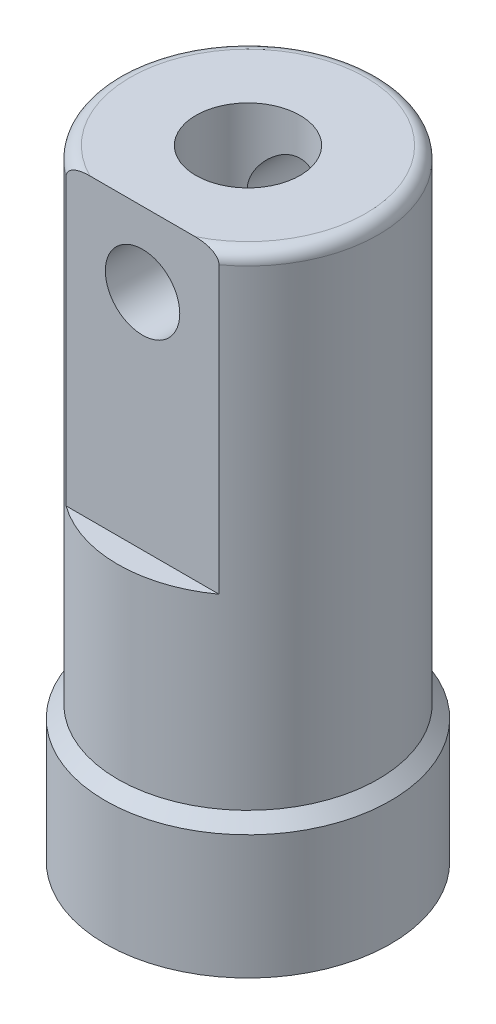
ISO-10303-21;
HEADER;
FILE_DESCRIPTION(('STEP AP214'),'2;1');
FILE_NAME('part.step','',(''),(''),'','','');
FILE_SCHEMA(('AUTOMOTIVE_DESIGN { 1 0 10303 214 1 1 1 1 }'));
ENDSEC;
DATA;
#1=APPLICATION_CONTEXT('core data for automotive mechanical design processes');
#2=APPLICATION_PROTOCOL_DEFINITION('international standard','automotive_design',2000,#1);
#3=PRODUCT_CONTEXT('',#1,'mechanical');
#4=PRODUCT('Part','Part','',(#3));
#5=PRODUCT_RELATED_PRODUCT_CATEGORY('part','',(#4));
#6=PRODUCT_DEFINITION_FORMATION('','',#4);
#7=PRODUCT_DEFINITION_CONTEXT('part definition',#1,'design');
#8=PRODUCT_DEFINITION('design','',#6,#7);
#9=PRODUCT_DEFINITION_SHAPE('','',#8);
#10=(LENGTH_UNIT() NAMED_UNIT(*) SI_UNIT(.MILLI.,.METRE.));
#11=(NAMED_UNIT(*) PLANE_ANGLE_UNIT() SI_UNIT($,.RADIAN.));
#12=(NAMED_UNIT(*) SI_UNIT($,.STERADIAN.) SOLID_ANGLE_UNIT());
#13=UNCERTAINTY_MEASURE_WITH_UNIT(LENGTH_MEASURE(1.E-05),#10,'distance_accuracy_value','');
#14=(GEOMETRIC_REPRESENTATION_CONTEXT(3) GLOBAL_UNCERTAINTY_ASSIGNED_CONTEXT((#13)) GLOBAL_UNIT_ASSIGNED_CONTEXT((#10,
#11,#12)) REPRESENTATION_CONTEXT('',''));
#15=CARTESIAN_POINT('',(0.,0.,0.));
#16=DIRECTION('',(0.,0.,1.));
#17=DIRECTION('',(1.,0.,0.));
#18=AXIS2_PLACEMENT_3D('',#15,#16,#17);
#19=CARTESIAN_POINT('',(0.,-5.,0.));
#20=DIRECTION('',(0.,-1.,0.));
#21=DIRECTION('',(0.,0.,-1.));
#22=AXIS2_PLACEMENT_3D('',#19,#20,#21);
#23=PLANE('',#22);
#24=CARTESIAN_POINT('',(0.,-5.,0.));
#25=DIRECTION('',(0.,1.,0.));
#26=DIRECTION('',(0.,0.,1.));
#27=AXIS2_PLACEMENT_3D('',#24,#25,#26);
#28=CIRCLE('',#27,5.75);
#29=CARTESIAN_POINT('',(0.,-5.,5.75));
#30=VERTEX_POINT('',#29);
#31=EDGE_CURVE('E183',#30,#30,#28,.T.);
#32=ORIENTED_EDGE('',*,*,#31,.F.);
#33=EDGE_LOOP('',(#32));
#34=FACE_BOUND('',#33,.T.);
#35=ADVANCED_FACE('F17',(#34),#23,.T.);
#36=CARTESIAN_POINT('',(0.,5.99999999991496,0.));
#37=DIRECTION('',(0.,1.,0.));
#38=DIRECTION('',(-1.,0.,0.));
#39=AXIS2_PLACEMENT_3D('',#36,#37,#38);
#40=CONICAL_SURFACE('',#39,2.09999999998445,1.0297442586746);
#41=CARTESIAN_POINT('',(0.,4.73819269996056,0.));
#42=VERTEX_POINT('',#41);
#43=VERTEX_LOOP('',#42);
#44=FACE_BOUND('',#43,.T.);
#45=CARTESIAN_POINT('',(0.,6.,0.));
#46=DIRECTION('',(0.,1.,0.));
#47=DIRECTION('',(0.,0.,1.));
#48=AXIS2_PLACEMENT_3D('',#45,#46,#47);
#49=CIRCLE('',#48,2.1);
#50=CARTESIAN_POINT('',(0.,6.,2.1));
#51=VERTEX_POINT('',#50);
#52=EDGE_CURVE('E182',#51,#51,#49,.T.);
#53=ORIENTED_EDGE('',*,*,#52,.T.);
#54=EDGE_LOOP('',(#53));
#55=FACE_BOUND('',#54,.T.);
#56=ADVANCED_FACE('F219',(#44,#55),#40,.F.);
#57=CARTESIAN_POINT('',(0.,-5.,0.));
#58=DIRECTION('',(0.,1.,0.));
#59=DIRECTION('',(0.,0.,1.));
#60=AXIS2_PLACEMENT_3D('',#57,#58,#59);
#61=CYLINDRICAL_SURFACE('',#60,5.75);
#62=CARTESIAN_POINT('',(0.,0.,0.));
#63=DIRECTION('',(0.,-1.,0.));
#64=DIRECTION('',(0.,0.,-1.));
#65=AXIS2_PLACEMENT_3D('',#62,#63,#64);
#66=CIRCLE('',#65,5.74999999992087);
#67=CARTESIAN_POINT('',(0.,0.,-5.74999999992087));
#68=VERTEX_POINT('',#67);
#69=EDGE_CURVE('E121',#68,#68,#66,.F.);
#70=ORIENTED_EDGE('',*,*,#69,.F.);
#71=EDGE_LOOP('',(#70));
#72=FACE_BOUND('',#71,.T.);
#73=ORIENTED_EDGE('',*,*,#31,.T.);
#74=EDGE_LOOP('',(#73));
#75=FACE_BOUND('',#74,.T.);
#76=ADVANCED_FACE('F174',(#72,#75),#61,.T.);
#77=CARTESIAN_POINT('',(0.,20.,0.));
#78=DIRECTION('',(0.,1.,0.));
#79=DIRECTION('',(0.,0.,1.));
#80=AXIS2_PLACEMENT_3D('',#77,#78,#79);
#81=CYLINDRICAL_SURFACE('',#80,2.1);
#82=CARTESIAN_POINT('',(0.,20.,0.));
#83=DIRECTION('',(0.,1.,0.));
#84=DIRECTION('',(0.,0.,1.));
#85=AXIS2_PLACEMENT_3D('',#82,#83,#84);
#86=CIRCLE('',#85,2.1);
#87=CARTESIAN_POINT('',(0.,20.,2.1));
#88=VERTEX_POINT('',#87);
#89=EDGE_CURVE('E168',#88,#88,#86,.T.);
#90=ORIENTED_EDGE('',*,*,#89,.T.);
#91=EDGE_LOOP('',(#90));
#92=FACE_BOUND('',#91,.T.);
#93=CARTESIAN_POINT('',(1.5,17.,1.4696938456699));
#94=CARTESIAN_POINT('',(1.4999931285405,17.0713415066346,1.46970692277126));
#95=CARTESIAN_POINT('',(1.49484935810921,17.1428183040006,1.47500728396917));
#96=CARTESIAN_POINT('',(1.47476313583704,17.2830947385916,1.49507714126609));
#97=CARTESIAN_POINT('',(1.45978557932529,17.3518838456713,1.50988055715931));
#98=CARTESIAN_POINT('',(1.42136852119966,17.4841494360841,1.5460892311944));
#99=CARTESIAN_POINT('',(1.39803450832146,17.5476805046318,1.56741172478963));
#100=CARTESIAN_POINT('',(1.34384027495623,17.6697441012513,1.61411663009445));
#101=CARTESIAN_POINT('',(1.3129813930372,17.7282775158377,1.63949831945435));
#102=CARTESIAN_POINT('',(1.23801296193488,17.8505114615197,1.69704035137877));
#103=CARTESIAN_POINT('',(1.19250935971338,17.9131750406712,1.72958770363064));
#104=CARTESIAN_POINT('',(1.09234191504186,18.0309069171597,1.79453696602969));
#105=CARTESIAN_POINT('',(1.03766655866763,18.0859655070153,1.82693864013381));
#106=CARTESIAN_POINT('',(0.90913216965419,18.1966127542585,1.89463534069194));
#107=CARTESIAN_POINT('',(0.833590466962477,18.2505817377757,1.92943254821958));
#108=CARTESIAN_POINT('',(0.671513177823279,18.3445412210329,1.99162128421022));
#109=CARTESIAN_POINT('',(0.584995553901287,18.3845541680033,2.01902468881819));
#110=CARTESIAN_POINT('',(0.428710729768957,18.4391130711093,2.05688642313278));
#111=CARTESIAN_POINT('',(0.360945723145483,18.4576436159245,2.06993610877064));
#112=CARTESIAN_POINT('',(0.222673655339252,18.4850402981048,2.08931726746869));
#113=CARTESIAN_POINT('',(0.152175731113078,18.4939361728556,2.09566941086043));
#114=CARTESIAN_POINT('',(0.054281439523006,18.4992662450265,2.09947640246213));
#115=CARTESIAN_POINT('',(0.0271488435942498,18.5000033977969,2.10000316300009));
#116=CARTESIAN_POINT('',(-0.0740774746463862,18.4999907288791,2.09999136953814));
#117=CARTESIAN_POINT('',(-0.14827591454497,18.4944679957679,2.09603741324159));
#118=CARTESIAN_POINT('',(-0.294386719965175,18.4726939392501,2.08057005792308));
#119=CARTESIAN_POINT('',(-0.366292084814356,18.4564125480304,2.06903547339457));
#120=CARTESIAN_POINT('',(-0.50529380231943,18.4141863835734,2.03953340345318));
#121=CARTESIAN_POINT('',(-0.572415937857228,18.3882989739888,2.02160412899963));
#122=CARTESIAN_POINT('',(-0.700974026975552,18.3280364236198,1.98070495357212));
#123=CARTESIAN_POINT('',(-0.762412185862326,18.2936645938237,1.95773701928955));
#124=CARTESIAN_POINT('',(-0.884155194324284,18.2140944597032,1.9060497195543));
#125=CARTESIAN_POINT('',(-0.943861887546157,18.1682007525709,1.87699896374307));
#126=CARTESIAN_POINT('',(-1.0552663678185,18.0686466369223,1.81671004533099));
#127=CARTESIAN_POINT('',(-1.10695119102018,18.014973922192,1.78546845807939));
#128=CARTESIAN_POINT('',(-1.21059475402294,17.8900645259193,1.71725705316428));
#129=CARTESIAN_POINT('',(-1.26085931094469,17.8174126080988,1.68028933951374));
#130=CARTESIAN_POINT('',(-1.34854978273903,17.6627847599485,1.61075672459648));
#131=CARTESIAN_POINT('',(-1.38599317902657,17.5808217299917,1.57818586532635));
#132=CARTESIAN_POINT('',(-1.43670850335998,17.4356339868733,1.53188030804105));
#133=CARTESIAN_POINT('',(-1.45387910413774,17.3746384272119,1.51544400861269));
#134=CARTESIAN_POINT('',(-1.48044612666174,17.2496496892322,1.48950779871937));
#135=CARTESIAN_POINT('',(-1.48987090646918,17.1856683598911,1.4799826013153));
#136=CARTESIAN_POINT('',(-1.49673351046121,17.1009879322807,1.47302125518522));
#137=CARTESIAN_POINT('',(-1.49795633302597,17.0808349603048,1.47177743170134));
#138=CARTESIAN_POINT('',(-1.49959065508117,17.0404582978322,1.47011176825378));
#139=CARTESIAN_POINT('',(-1.50000194895198,17.0202345907132,1.46969013661179));
#140=CARTESIAN_POINT('',(-1.4999931285405,16.9286584933654,1.46970692277126));
#141=CARTESIAN_POINT('',(-1.49484935810922,16.8571816959994,1.47500728396917));
#142=CARTESIAN_POINT('',(-1.47476313583705,16.7169052614084,1.49507714126609));
#143=CARTESIAN_POINT('',(-1.4597855793253,16.6481161543288,1.5098805571593));
#144=CARTESIAN_POINT('',(-1.42136852119967,16.5158505639159,1.5460892311944));
#145=CARTESIAN_POINT('',(-1.39803450832147,16.4523194953682,1.56741172478963));
#146=CARTESIAN_POINT('',(-1.34384027495624,16.3302558987487,1.61411663009445));
#147=CARTESIAN_POINT('',(-1.31298139303721,16.2717224841623,1.63949831945434));
#148=CARTESIAN_POINT('',(-1.23801296193489,16.1494885384804,1.69704035137877));
#149=CARTESIAN_POINT('',(-1.19250935971338,16.0868249593288,1.72958770363063));
#150=CARTESIAN_POINT('',(-1.09234191504187,15.9690930828403,1.79453696602969));
#151=CARTESIAN_POINT('',(-1.03766655866764,15.9140344929847,1.8269386401338));
#152=CARTESIAN_POINT('',(-0.909132169654205,15.8033872457416,1.89463534069193));
#153=CARTESIAN_POINT('',(-0.833590466962493,15.7494182622244,1.92943254821957));
#154=CARTESIAN_POINT('',(-0.671513177823297,15.6554587789671,1.99162128421022));
#155=CARTESIAN_POINT('',(-0.584995553901305,15.6154458319967,2.01902468881818));
#156=CARTESIAN_POINT('',(-0.428710729768977,15.5608869288907,2.05688642313277));
#157=CARTESIAN_POINT('',(-0.360945723145504,15.5423563840755,2.06993610877063));
#158=CARTESIAN_POINT('',(-0.222673655339272,15.5149597018952,2.08931726746868));
#159=CARTESIAN_POINT('',(-0.152175731113099,15.5060638271444,2.09566941086043));
#160=CARTESIAN_POINT('',(-0.0542814395230195,15.5007337549735,2.09947640246213));
#161=CARTESIAN_POINT('',(-0.0271488435942567,15.4999966022031,2.10000316300009));
#162=CARTESIAN_POINT('',(0.074077474646386,15.5000092711209,2.09999136953814));
#163=CARTESIAN_POINT('',(0.14827591454497,15.5055320042321,2.09603741324159));
#164=CARTESIAN_POINT('',(0.294386719965174,15.5273060607499,2.08057005792308));
#165=CARTESIAN_POINT('',(0.366292084814355,15.5435874519696,2.06903547339457));
#166=CARTESIAN_POINT('',(0.50529380231943,15.5858136164266,2.03953340345318));
#167=CARTESIAN_POINT('',(0.572415937857228,15.6117010260112,2.02160412899963));
#168=CARTESIAN_POINT('',(0.700974026975552,15.6719635763802,1.98070495357212));
#169=CARTESIAN_POINT('',(0.762412185862325,15.7063354061763,1.95773701928955));
#170=CARTESIAN_POINT('',(0.884155194324283,15.7859055402968,1.9060497195543));
#171=CARTESIAN_POINT('',(0.943861887546157,15.8317992474291,1.87699896374307));
#172=CARTESIAN_POINT('',(1.0552663678185,15.9313533630777,1.81671004533099));
#173=CARTESIAN_POINT('',(1.10695119102018,15.985026077808,1.78546845807939));
#174=CARTESIAN_POINT('',(1.21059475402294,16.1099354740807,1.71725705316428));
#175=CARTESIAN_POINT('',(1.26085931094469,16.1825873919012,1.68028933951374));
#176=CARTESIAN_POINT('',(1.34854978273903,16.3372152400515,1.61075672459648));
#177=CARTESIAN_POINT('',(1.38599317902657,16.4191782700083,1.57818586532635));
#178=CARTESIAN_POINT('',(1.43670850335998,16.5643660131267,1.53188030804105));
#179=CARTESIAN_POINT('',(1.45387910413774,16.6253615727881,1.51544400861269));
#180=CARTESIAN_POINT('',(1.48044612666174,16.7503503107678,1.48950779871937));
#181=CARTESIAN_POINT('',(1.48987090646917,16.8143316401089,1.4799826013153));
#182=CARTESIAN_POINT('',(1.49673351046121,16.8990120677193,1.47302125518522));
#183=CARTESIAN_POINT('',(1.49795633302597,16.9191650396953,1.47177743170134));
#184=CARTESIAN_POINT('',(1.49959065508117,16.9595417021678,1.47011176825378));
#185=CARTESIAN_POINT('',(1.50000194895198,16.9797654092868,1.4696901366118));
#186=CARTESIAN_POINT('',(1.5,17.,1.4696938456699));
#187=B_SPLINE_CURVE_WITH_KNOTS('',3,(#93,#94,#95,#96,#97,#98,#99,#100,#101,#102,#103,#104,#105,
#106,#107,#108,#109,#110,#111,#112,#113,#114,#115,#116,#117,#118,#119,#120,#121,#122,#123,#124,
#125,#126,#127,#128,#129,#130,#131,#132,#133,#134,#135,#136,#137,#138,#139,#140,#141,#142,#143,
#144,#145,#146,#147,#148,#149,#150,#151,#152,#153,#154,#155,#156,#157,#158,#159,#160,#161,#162,
#163,#164,#165,#166,#167,#168,#169,#170,#171,#172,#173,#174,#175,#176,#177,#178,#179,#180,#181,
#182,#183,#184,#185,#186),.UNSPECIFIED.,.T.,.F.,(4,2,2,2,2,2,2,2,2,2,2,2,2,2,2,2,2,2,2,2,2,2,2,
2,2,2,2,2,2,2,2,2,2,2,2,2,2,2,2,2,2,2,2,2,2,2,4),(0.,0.213921257408544,0.428610354028383,
0.640679666153003,0.852711281624641,1.10383423618858,1.35527483453572,1.65106851436463,
1.94638421436098,2.15986290495585,2.37268079966103,2.45409485818243,2.67623867933788,
2.89900597877126,3.1204638575178,3.34183545006003,3.58310340514435,3.82475729332538,
4.11080766619244,4.39646644695796,4.59215190229597,4.7871177056141,4.84777682199136,
4.90845130579055,5.12237256319909,5.33706165981893,5.54913097194355,5.76116258741518,
6.01228554197912,6.26372614032626,6.55951982015516,6.85483552015152,7.06831421074639,
7.28113210545157,7.36254616397298,7.58468998512843,7.80745728456182,8.02891516330836,
8.25028675585058,8.49155471093491,8.73320859911593,9.019258971983,9.30491775274852,
9.50060320808653,9.69556901140466,9.75622812778191,9.81690261158111),.UNSPECIFIED.);
#188=CARTESIAN_POINT('',(1.5,17.,1.4696938456699));
#189=VERTEX_POINT('',#188);
#190=EDGE_CURVE('E177',#189,#189,#187,.T.);
#191=ORIENTED_EDGE('',*,*,#190,.T.);
#192=EDGE_LOOP('',(#191));
#193=FACE_BOUND('',#192,.T.);
#194=ORIENTED_EDGE('',*,*,#52,.F.);
#195=EDGE_LOOP('',(#194));
#196=FACE_BOUND('',#195,.T.);
#197=CARTESIAN_POINT('',(-1.5,17.,-1.4696938456699));
#198=CARTESIAN_POINT('',(-1.4999931285405,17.0713415066346,-1.46970692277126));
#199=CARTESIAN_POINT('',(-1.49484935810922,17.1428183040006,-1.47500728396917));
#200=CARTESIAN_POINT('',(-1.47476313583704,17.2830947385916,-1.49507714126609));
#201=CARTESIAN_POINT('',(-1.45978557932529,17.3518838456713,-1.50988055715931));
#202=CARTESIAN_POINT('',(-1.42136852119966,17.4841494360841,-1.5460892311944));
#203=CARTESIAN_POINT('',(-1.39803450832146,17.5476805046318,-1.56741172478963));
#204=CARTESIAN_POINT('',(-1.34384027495624,17.6697441012513,-1.61411663009445));
#205=CARTESIAN_POINT('',(-1.31298139303721,17.7282775158377,-1.63949831945435));
#206=CARTESIAN_POINT('',(-1.23801296193488,17.8505114615197,-1.69704035137877));
#207=CARTESIAN_POINT('',(-1.19250935971338,17.9131750406712,-1.72958770363064));
#208=CARTESIAN_POINT('',(-1.09234191504187,18.0309069171597,-1.79453696602969));
#209=CARTESIAN_POINT('',(-1.03766655866763,18.0859655070153,-1.8269386401338));
#210=CARTESIAN_POINT('',(-0.909132169654193,18.1966127542585,-1.89463534069194));
#211=CARTESIAN_POINT('',(-0.833590466962479,18.2505817377757,-1.92943254821958));
#212=CARTESIAN_POINT('',(-0.671513177823282,18.3445412210329,-1.99162128421022));
#213=CARTESIAN_POINT('',(-0.58499555390129,18.3845541680033,-2.01902468881819));
#214=CARTESIAN_POINT('',(-0.428710729768961,18.4391130711093,-2.05688642313278));
#215=CARTESIAN_POINT('',(-0.360945723145488,18.4576436159245,-2.06993610877064));
#216=CARTESIAN_POINT('',(-0.222673655339257,18.4850402981048,-2.08931726746869));
#217=CARTESIAN_POINT('',(-0.152175731113083,18.4939361728556,-2.09566941086043));
#218=CARTESIAN_POINT('',(-0.0542814395230025,18.4992662450265,-2.09947640246213));
#219=CARTESIAN_POINT('',(-0.0271488435942383,18.5000033977969,-2.10000316300009));
#220=CARTESIAN_POINT('',(0.0740774746464061,18.4999907288791,-2.09999136953814));
#221=CARTESIAN_POINT('',(0.14827591454499,18.4944679957679,-2.09603741324158));
#222=CARTESIAN_POINT('',(0.294386719965195,18.4726939392501,-2.08057005792308));
#223=CARTESIAN_POINT('',(0.366292084814377,18.4564125480304,-2.06903547339457));
#224=CARTESIAN_POINT('',(0.50529380231945,18.4141863835734,-2.03953340345317));
#225=CARTESIAN_POINT('',(0.572415937857247,18.3882989739888,-2.02160412899963));
#226=CARTESIAN_POINT('',(0.700974026975571,18.3280364236198,-1.98070495357212));
#227=CARTESIAN_POINT('',(0.762412185862345,18.2936645938237,-1.95773701928954));
#228=CARTESIAN_POINT('',(0.884155194324302,18.2140944597032,-1.90604971955429));
#229=CARTESIAN_POINT('',(0.943861887546175,18.1682007525709,-1.87699896374306));
#230=CARTESIAN_POINT('',(1.05526636781852,18.0686466369223,-1.81671004533098));
#231=CARTESIAN_POINT('',(1.1069511910202,18.014973922192,-1.78546845807938));
#232=CARTESIAN_POINT('',(1.21059475402296,17.8900645259193,-1.71725705316427));
#233=CARTESIAN_POINT('',(1.26085931094471,17.8174126080988,-1.68028933951373));
#234=CARTESIAN_POINT('',(1.34854978273905,17.6627847599485,-1.61075672459646));
#235=CARTESIAN_POINT('',(1.38599317902658,17.5808217299917,-1.57818586532633));
#236=CARTESIAN_POINT('',(1.43670850335999,17.4356339868733,-1.53188030804105));
#237=CARTESIAN_POINT('',(1.45387910413775,17.3746384272119,-1.51544400861268));
#238=CARTESIAN_POINT('',(1.48044612666175,17.2496496892322,-1.48950779871936));
#239=CARTESIAN_POINT('',(1.48987090646918,17.1856683598911,-1.4799826013153));
#240=CARTESIAN_POINT('',(1.49673351046121,17.1009879322807,-1.47302125518522));
#241=CARTESIAN_POINT('',(1.49795633302597,17.0808349603047,-1.47177743170134));
#242=CARTESIAN_POINT('',(1.49959065508117,17.0404582978322,-1.47011176825378));
#243=CARTESIAN_POINT('',(1.50000194895198,17.0202345907132,-1.4696901366118));
#244=CARTESIAN_POINT('',(1.4999931285405,16.9286584933654,-1.46970692277126));
#245=CARTESIAN_POINT('',(1.49484935810921,16.8571816959994,-1.47500728396917));
#246=CARTESIAN_POINT('',(1.47476313583704,16.7169052614084,-1.49507714126609));
#247=CARTESIAN_POINT('',(1.45978557932529,16.6481161543287,-1.50988055715931));
#248=CARTESIAN_POINT('',(1.42136852119966,16.5158505639159,-1.5460892311944));
#249=CARTESIAN_POINT('',(1.39803450832146,16.4523194953682,-1.56741172478963));
#250=CARTESIAN_POINT('',(1.34384027495624,16.3302558987487,-1.61411663009445));
#251=CARTESIAN_POINT('',(1.3129813930372,16.2717224841623,-1.63949831945435));
#252=CARTESIAN_POINT('',(1.23801296193488,16.1494885384804,-1.69704035137877));
#253=CARTESIAN_POINT('',(1.19250935971337,16.0868249593288,-1.72958770363064));
#254=CARTESIAN_POINT('',(1.09234191504186,15.9690930828403,-1.7945369660297));
#255=CARTESIAN_POINT('',(1.03766655866763,15.9140344929847,-1.82693864013381));
#256=CARTESIAN_POINT('',(0.909132169654191,15.8033872457415,-1.89463534069194));
#257=CARTESIAN_POINT('',(0.833590466962478,15.7494182622243,-1.92943254821958));
#258=CARTESIAN_POINT('',(0.67151317782328,15.6554587789671,-1.99162128421022));
#259=CARTESIAN_POINT('',(0.584995553901288,15.6154458319967,-2.01902468881819));
#260=CARTESIAN_POINT('',(0.428710729768959,15.5608869288907,-2.05688642313278));
#261=CARTESIAN_POINT('',(0.360945723145486,15.5423563840755,-2.06993610877064));
#262=CARTESIAN_POINT('',(0.222673655339253,15.5149597018952,-2.08931726746869));
#263=CARTESIAN_POINT('',(0.15217573111308,15.5060638271444,-2.09566941086043));
#264=CARTESIAN_POINT('',(0.0542814395230084,15.5007337549735,-2.09947640246213));
#265=CARTESIAN_POINT('',(0.0271488435942534,15.4999966022031,-2.10000316300009));
#266=CARTESIAN_POINT('',(-0.0740774746463816,15.5000092711209,-2.09999136953814));
#267=CARTESIAN_POINT('',(-0.148275914544966,15.5055320042321,-2.09603741324159));
#268=CARTESIAN_POINT('',(-0.29438671996517,15.5273060607499,-2.08057005792308));
#269=CARTESIAN_POINT('',(-0.366292084814351,15.5435874519696,-2.06903547339457));
#270=CARTESIAN_POINT('',(-0.505293802319425,15.5858136164266,-2.03953340345318));
#271=CARTESIAN_POINT('',(-0.572415937857224,15.6117010260112,-2.02160412899963));
#272=CARTESIAN_POINT('',(-0.700974026975548,15.6719635763802,-1.98070495357213));
#273=CARTESIAN_POINT('',(-0.762412185862322,15.7063354061763,-1.95773701928955));
#274=CARTESIAN_POINT('',(-0.884155194324279,15.7859055402968,-1.9060497195543));
#275=CARTESIAN_POINT('',(-0.943861887546151,15.8317992474291,-1.87699896374308));
#276=CARTESIAN_POINT('',(-1.0552663678185,15.9313533630777,-1.816710045331));
#277=CARTESIAN_POINT('',(-1.10695119102017,15.985026077808,-1.78546845807939));
#278=CARTESIAN_POINT('',(-1.21059475402294,16.1099354740807,-1.71725705316428));
#279=CARTESIAN_POINT('',(-1.26085931094469,16.1825873919012,-1.68028933951374));
#280=CARTESIAN_POINT('',(-1.34854978273903,16.3372152400515,-1.61075672459648));
#281=CARTESIAN_POINT('',(-1.38599317902657,16.4191782700083,-1.57818586532635));
#282=CARTESIAN_POINT('',(-1.43670850335998,16.5643660131267,-1.53188030804106));
#283=CARTESIAN_POINT('',(-1.45387910413774,16.6253615727881,-1.51544400861269));
#284=CARTESIAN_POINT('',(-1.48044612666174,16.7503503107678,-1.48950779871937));
#285=CARTESIAN_POINT('',(-1.48987090646918,16.8143316401089,-1.4799826013153));
#286=CARTESIAN_POINT('',(-1.49673351046121,16.8990120677193,-1.47302125518522));
#287=CARTESIAN_POINT('',(-1.49795633302597,16.9191650396953,-1.47177743170134));
#288=CARTESIAN_POINT('',(-1.49959065508117,16.9595417021678,-1.47011176825378));
#289=CARTESIAN_POINT('',(-1.50000194895198,16.9797654092868,-1.46969013661179));
#290=CARTESIAN_POINT('',(-1.5,17.,-1.4696938456699));
#291=B_SPLINE_CURVE_WITH_KNOTS('',3,(#197,#198,#199,#200,#201,#202,#203,#204,#205,#206,#207,
#208,#209,#210,#211,#212,#213,#214,#215,#216,#217,#218,#219,#220,#221,#222,#223,#224,#225,#226,
#227,#228,#229,#230,#231,#232,#233,#234,#235,#236,#237,#238,#239,#240,#241,#242,#243,#244,#245,
#246,#247,#248,#249,#250,#251,#252,#253,#254,#255,#256,#257,#258,#259,#260,#261,#262,#263,#264,
#265,#266,#267,#268,#269,#270,#271,#272,#273,#274,#275,#276,#277,#278,#279,#280,#281,#282,#283,
#284,#285,#286,#287,#288,#289,#290),.UNSPECIFIED.,.T.,.F.,(4,2,2,2,2,2,2,2,2,2,2,2,2,2,2,2,2,2,
2,2,2,2,2,2,2,2,2,2,2,2,2,2,2,2,2,2,2,2,2,2,2,2,2,2,2,2,4),(0.,0.213921257408544,
0.428610354028383,0.640679666153003,0.852711281624641,1.10383423618858,1.35527483453572,
1.65106851436462,1.94638421436098,2.15986290495585,2.37268079966103,2.45409485818245,
2.6762386793379,2.89900597877129,3.12046385751783,3.34183545006005,3.58310340514438,
3.82475729332541,4.11080766619248,4.396466446958,4.59215190229601,4.78711770561413,
4.84777682199137,4.90845130579056,5.1223725631991,5.33706165981894,5.54913097194356,
5.7611625874152,6.01228554197913,6.26372614032628,6.55951982015518,6.85483552015153,
7.0683142107464,7.28113210545158,7.36254616397298,7.58468998512843,7.80745728456181,
8.02891516330835,8.25028675585058,8.4915547109349,8.73320859911593,9.01925897198299,
9.30491775274851,9.50060320808652,9.69556901140466,9.75622812778191,9.81690261158111),.UNSPECIFIED.);
#292=CARTESIAN_POINT('',(-1.5,17.,-1.4696938456699));
#293=VERTEX_POINT('',#292);
#294=EDGE_CURVE('E163',#293,#293,#291,.T.);
#295=ORIENTED_EDGE('',*,*,#294,.T.);
#296=EDGE_LOOP('',(#295));
#297=FACE_BOUND('',#296,.T.);
#298=ADVANCED_FACE('F170',(#92,#193,#196,#297),#81,.F.);
#299=CARTESIAN_POINT('',(0.,17.,-7.75));
#300=DIRECTION('',(0.,0.,1.));
#301=DIRECTION('',(1.,0.,0.));
#302=AXIS2_PLACEMENT_3D('',#299,#300,#301);
#303=CYLINDRICAL_SURFACE('',#302,1.5);
#304=ORIENTED_EDGE('',*,*,#190,.F.);
#305=EDGE_LOOP('',(#304));
#306=FACE_BOUND('',#305,.T.);
#307=CARTESIAN_POINT('',(0.,17.,4.25));
#308=DIRECTION('',(0.,0.,1.));
#309=DIRECTION('',(1.,0.,0.));
#310=AXIS2_PLACEMENT_3D('',#307,#308,#309);
#311=CIRCLE('',#310,1.5);
#312=CARTESIAN_POINT('',(1.5,17.,4.25));
#313=VERTEX_POINT('',#312);
#314=EDGE_CURVE('E148',#313,#313,#311,.T.);
#315=ORIENTED_EDGE('',*,*,#314,.T.);
#316=EDGE_LOOP('',(#315));
#317=FACE_BOUND('',#316,.T.);
#318=ADVANCED_FACE('F101',(#306,#317),#303,.F.);
#319=CARTESIAN_POINT('',(0.,20.,-5.25));
#320=DIRECTION('',(0.,-1.,0.));
#321=DIRECTION('',(0.,0.,-1.));
#322=AXIS2_PLACEMENT_3D('',#319,#320,#321);
#323=PLANE('',#322);
#324=CARTESIAN_POINT('',(0.,20.,0.));
#325=DIRECTION('',(0.,-1.,0.));
#326=DIRECTION('',(0.,0.,-1.));
#327=AXIS2_PLACEMENT_3D('',#324,#325,#326);
#328=CIRCLE('',#327,4.75);
#329=CARTESIAN_POINT('',(0.,20.,-4.75));
#330=VERTEX_POINT('',#329);
#331=CARTESIAN_POINT('',(2.12132034355964,20.,4.25));
#332=VERTEX_POINT('',#331);
#333=EDGE_CURVE('E117',#330,#332,#328,.T.);
#334=ORIENTED_EDGE('',*,*,#333,.F.);
#335=CARTESIAN_POINT('',(0.,20.,0.));
#336=DIRECTION('',(0.,-1.,0.));
#337=DIRECTION('',(-0.446593756538872,0.,0.894736842105263));
#338=AXIS2_PLACEMENT_3D('',#335,#336,#337);
#339=CIRCLE('',#338,4.75);
#340=CARTESIAN_POINT('',(-2.12132034355964,20.,4.25));
#341=VERTEX_POINT('',#340);
#342=EDGE_CURVE('E84',#341,#330,#339,.T.);
#343=ORIENTED_EDGE('',*,*,#342,.F.);
#344=DIRECTION('',(-1.,0.,0.));
#345=VECTOR('',#344,1.);
#346=CARTESIAN_POINT('',(-3.08220700148449,20.,4.25));
#347=LINE('',#346,#345);
#348=EDGE_CURVE('E68',#341,#332,#347,.F.);
#349=ORIENTED_EDGE('',*,*,#348,.T.);
#350=EDGE_LOOP('',(#334,#343,#349));
#351=FACE_BOUND('',#350,.T.);
#352=ORIENTED_EDGE('',*,*,#89,.F.);
#353=EDGE_LOOP('',(#352));
#354=FACE_BOUND('',#353,.T.);
#355=ADVANCED_FACE('F90',(#351,#354),#323,.F.);
#356=CARTESIAN_POINT('',(0.,0.,0.));
#357=DIRECTION('',(0.,-1.,0.));
#358=DIRECTION('',(0.,0.,-1.));
#359=AXIS2_PLACEMENT_3D('',#356,#357,#358);
#360=CONICAL_SURFACE('',#359,5.74999999992087,0.785398163340605);
#361=ORIENTED_EDGE('',*,*,#69,.T.);
#362=EDGE_LOOP('',(#361));
#363=FACE_BOUND('',#362,.T.);
#364=CARTESIAN_POINT('',(0.,0.499999999999997,0.));
#365=DIRECTION('',(0.,1.,0.));
#366=DIRECTION('',(0.,0.,1.));
#367=AXIS2_PLACEMENT_3D('',#364,#365,#366);
#368=CIRCLE('',#367,5.25);
#369=CARTESIAN_POINT('',(0.,0.499999999999997,5.25));
#370=VERTEX_POINT('',#369);
#371=EDGE_CURVE('E72',#370,#370,#368,.T.);
#372=ORIENTED_EDGE('',*,*,#371,.F.);
#373=EDGE_LOOP('',(#372));
#374=FACE_BOUND('',#373,.T.);
#375=ADVANCED_FACE('F100',(#363,#374),#360,.T.);
#376=CARTESIAN_POINT('',(0.,17.,-7.75));
#377=DIRECTION('',(0.,0.,1.));
#378=DIRECTION('',(1.,0.,0.));
#379=AXIS2_PLACEMENT_3D('',#376,#377,#378);
#380=CYLINDRICAL_SURFACE('',#379,1.5);
#381=CARTESIAN_POINT('',(0.,15.5,-5.25));
#382=CARTESIAN_POINT('',(0.0824260618647319,15.5000035470745,-5.2499976761975));
#383=CARTESIAN_POINT('',(0.164896921895743,15.5068200871303,-5.24803887648495));
#384=CARTESIAN_POINT('',(0.32747918707062,15.5338614461896,-5.24041028439696));
#385=CARTESIAN_POINT('',(0.407588322335111,15.5540987516906,-5.23473703621186));
#386=CARTESIAN_POINT('',(0.56303230058791,15.6072579762875,-5.22030459996066));
#387=CARTESIAN_POINT('',(0.638374574677171,15.6401595557774,-5.21155036207558));
#388=CARTESIAN_POINT('',(0.782461250020171,15.7176395512017,-5.19187338008697));
#389=CARTESIAN_POINT('',(0.851205854879477,15.7622176066388,-5.18095070293391));
#390=CARTESIAN_POINT('',(0.981964018140688,15.8630209469604,-5.15778668802943));
#391=CARTESIAN_POINT('',(1.04378016089226,15.9194965412163,-5.14552029125884));
#392=CARTESIAN_POINT('',(1.15721811501936,16.0419729610222,-5.1212029735158));
#393=CARTESIAN_POINT('',(1.20883632799538,16.1079771346199,-5.10915212996181));
#394=CARTESIAN_POINT('',(1.30142122933138,16.2492782261635,-5.08636689476203));
#395=CARTESIAN_POINT('',(1.34214794130816,16.3247378697493,-5.07566454447728));
#396=CARTESIAN_POINT('',(1.41021679667925,16.4817428031049,-5.05717752071934));
#397=CARTESIAN_POINT('',(1.43757493532545,16.5632806850144,-5.04938936309606));
#398=CARTESIAN_POINT('',(1.47177510177923,16.7043451311279,-5.0395021369137));
#399=CARTESIAN_POINT('',(1.48233966343858,16.7629248150896,-5.03638991880472));
#400=CARTESIAN_POINT('',(1.49645322110758,16.8809952064911,-5.03221440153175));
#401=CARTESIAN_POINT('',(1.50000260864035,16.9404858629021,-5.03115098802223));
#402=CARTESIAN_POINT('',(1.49999639046667,17.0823487459319,-5.03115566326588));
#403=CARTESIAN_POINT('',(1.49319219728931,17.1647424475361,-5.03319812340327));
#404=CARTESIAN_POINT('',(1.46620434633812,17.3271641682389,-5.0411242896018));
#405=CARTESIAN_POINT('',(1.44600793041343,17.4071898554255,-5.04701165844864));
#406=CARTESIAN_POINT('',(1.39296814895042,17.5624569065585,-5.06190593160319));
#407=CARTESIAN_POINT('',(1.36014698558027,17.6377064008802,-5.07090735668027));
#408=CARTESIAN_POINT('',(1.28285675576292,17.7816354265711,-5.09100836939558));
#409=CARTESIAN_POINT('',(1.23838786706739,17.8503150581788,-5.10210792501429));
#410=CARTESIAN_POINT('',(1.13769890085941,17.9811368570851,-5.12551218421236));
#411=CARTESIAN_POINT('',(1.0812039106935,18.0430632193207,-5.13784068123398));
#412=CARTESIAN_POINT('',(0.958641278226149,18.1567166800664,-5.16211230899859));
#413=CARTESIAN_POINT('',(0.892570587171525,18.2084405178228,-5.17405531552109));
#414=CARTESIAN_POINT('',(0.75120172368789,18.3011441347853,-5.19648055442425));
#415=CARTESIAN_POINT('',(0.675752150469659,18.3419012367012,-5.20693074057453));
#416=CARTESIAN_POINT('',(0.518768280033854,18.4100291720923,-5.22490136155436));
#417=CARTESIAN_POINT('',(0.437241216179771,18.4374156349598,-5.23242521497009));
#418=CARTESIAN_POINT('',(0.296103503685334,18.4716889228979,-5.24196480728704));
#419=CARTESIAN_POINT('',(0.237433365488712,18.4822860160821,-5.24496194541003));
#420=CARTESIAN_POINT('',(0.119183264005417,18.4964426690477,-5.24898033476898));
#421=CARTESIAN_POINT('',(0.0596033443081171,18.5000025649352,-5.25000168037145));
#422=CARTESIAN_POINT('',(-0.0824260618652033,18.4999964529255,-5.2499976761975));
#423=CARTESIAN_POINT('',(-0.164896921896214,18.4931799128697,-5.24803887648493));
#424=CARTESIAN_POINT('',(-0.327479187071087,18.4661385538102,-5.24041028439693));
#425=CARTESIAN_POINT('',(-0.407588322335573,18.4459012483093,-5.23473703621183));
#426=CARTESIAN_POINT('',(-0.563032300588358,18.3927420237124,-5.22030459996062));
#427=CARTESIAN_POINT('',(-0.638374574677611,18.3598404442224,-5.21155036207552));
#428=CARTESIAN_POINT('',(-0.782461250020589,18.2823604487981,-5.1918733800869));
#429=CARTESIAN_POINT('',(-0.851205854879882,18.2377823933609,-5.18095070293384));
#430=CARTESIAN_POINT('',(-0.981964018141062,18.1369790530392,-5.15778668802936));
#431=CARTESIAN_POINT('',(-1.04378016089261,18.0805034587833,-5.14552029125877));
#432=CARTESIAN_POINT('',(-1.15721811501968,17.9580270389775,-5.12120297351573));
#433=CARTESIAN_POINT('',(-1.20883632799569,17.8920228653797,-5.10915212996174));
#434=CARTESIAN_POINT('',(-1.30142122933163,17.7507217738361,-5.08636689476196));
#435=CARTESIAN_POINT('',(-1.34214794130839,17.6752621302503,-5.07566454447722));
#436=CARTESIAN_POINT('',(-1.41021679667943,17.5182571968946,-5.05717752071929));
#437=CARTESIAN_POINT('',(-1.4375749353256,17.4367193149851,-5.04938936309601));
#438=CARTESIAN_POINT('',(-1.47177510177931,17.2956548688717,-5.03950213691368));
#439=CARTESIAN_POINT('',(-1.48233966343863,17.2370751849101,-5.03638991880471));
#440=CARTESIAN_POINT('',(-1.49645322110759,17.1190047935087,-5.03221440153174));
#441=CARTESIAN_POINT('',(-1.50000260864035,17.0595141370979,-5.03115098802223));
#442=CARTESIAN_POINT('',(-1.49999639046667,16.9176512540681,-5.03115566326588));
#443=CARTESIAN_POINT('',(-1.49319219728931,16.8352575524639,-5.03319812340327));
#444=CARTESIAN_POINT('',(-1.46620434633812,16.6728358317611,-5.0411242896018));
#445=CARTESIAN_POINT('',(-1.44600793041343,16.5928101445746,-5.04701165844864));
#446=CARTESIAN_POINT('',(-1.39296814895042,16.4375430934415,-5.06190593160319));
#447=CARTESIAN_POINT('',(-1.36014698558027,16.3622935991198,-5.07090735668027));
#448=CARTESIAN_POINT('',(-1.28285675576292,16.2183645734289,-5.09100836939558));
#449=CARTESIAN_POINT('',(-1.23838786706739,16.1496849418212,-5.10210792501429));
#450=CARTESIAN_POINT('',(-1.13769890085941,16.0188631429149,-5.12551218421235));
#451=CARTESIAN_POINT('',(-1.0812039106935,15.9569367806793,-5.13784068123398));
#452=CARTESIAN_POINT('',(-0.95864127822615,15.8432833199336,-5.16211230899859));
#453=CARTESIAN_POINT('',(-0.892570587171526,15.7915594821772,-5.17405531552109));
#454=CARTESIAN_POINT('',(-0.751201723687892,15.6988558652147,-5.19648055442425));
#455=CARTESIAN_POINT('',(-0.675752150469661,15.6580987632988,-5.20693074057453));
#456=CARTESIAN_POINT('',(-0.518768280033856,15.5899708279077,-5.22490136155436));
#457=CARTESIAN_POINT('',(-0.437241216179774,15.5625843650402,-5.23242521497009));
#458=CARTESIAN_POINT('',(-0.296103503685411,15.5283110771021,-5.24196480728704));
#459=CARTESIAN_POINT('',(-0.237433365488866,15.5177139839179,-5.24496194541002));
#460=CARTESIAN_POINT('',(-0.119183264005728,15.5035573309523,-5.24898033476898));
#461=CARTESIAN_POINT('',(-0.0596033443085079,15.4999974350649,-5.25000168037144));
#462=CARTESIAN_POINT('',(0.,15.5,-5.25));
#463=B_SPLINE_CURVE_WITH_KNOTS('',3,(#381,#382,#383,#384,#385,#386,#387,#388,#389,#390,#391,
#392,#393,#394,#395,#396,#397,#398,#399,#400,#401,#402,#403,#404,#405,#406,#407,#408,#409,#410,
#411,#412,#413,#414,#415,#416,#417,#418,#419,#420,#421,#422,#423,#424,#425,#426,#427,#428,#429,
#430,#431,#432,#433,#434,#435,#436,#437,#438,#439,#440,#441,#442,#443,#444,#445,#446,#447,#448,
#449,#450,#451,#452,#453,#454,#455,#456,#457,#458,#459,#460,#461,#462),.UNSPECIFIED.,.T.,.F.,(4,
2,2,2,2,2,2,2,2,2,2,2,2,2,2,2,2,2,2,2,2,2,2,2,2,2,2,2,2,2,2,2,2,2,2,2,2,2,2,2,4),(0.,
0.247056163755916,0.494342508284552,0.741233341747892,0.988116553652607,1.24083301281101,
1.49363848581623,1.75162503695219,2.00930215148157,2.18769372007361,2.36607533219195,
2.61289907477732,2.85995829338507,3.10658499994086,3.35320794303626,3.60622852556248,
3.85932984357347,4.11723745529194,4.37484286393001,4.55350088316776,4.73215036924982,
4.97920653300574,5.22649287753438,5.47338371099773,5.72026692290245,5.97298338206086,
6.22578885506609,6.48377540620205,6.74145252073143,6.91984408932321,7.0982257014413,
7.34504944402667,7.59210866263442,7.83873536919021,8.08535831228561,8.33837889481184,
8.59148021282282,8.8493878245413,9.10699323317936,9.28565125241688,9.46430073849871),.UNSPECIFIED.);
#464=CARTESIAN_POINT('',(0.,15.5,-5.25));
#465=VERTEX_POINT('',#464);
#466=EDGE_CURVE('E62',#465,#465,#463,.T.);
#467=ORIENTED_EDGE('',*,*,#466,.F.);
#468=EDGE_LOOP('',(#467));
#469=FACE_BOUND('',#468,.T.);
#470=ORIENTED_EDGE('',*,*,#294,.F.);
#471=EDGE_LOOP('',(#470));
#472=FACE_BOUND('',#471,.T.);
#473=ADVANCED_FACE('F133',(#469,#472),#380,.F.);
#474=CARTESIAN_POINT('',(0.,19.5,0.));
#475=DIRECTION('',(0.,-1.,0.));
#476=DIRECTION('',(0.,0.,-1.));
#477=AXIS2_PLACEMENT_3D('',#474,#475,#476);
#478=TOROIDAL_SURFACE('',#477,4.75,0.5);
#479=CARTESIAN_POINT('',(2.12132034355964,20.,4.25));
#480=CARTESIAN_POINT('',(2.16317923140248,19.9999858712532,4.25));
#481=CARTESIAN_POINT('',(2.20506280923918,19.9989497717641,4.25));
#482=CARTESIAN_POINT('',(2.2888368178019,19.994434332913,4.25));
#483=CARTESIAN_POINT('',(2.33072678892598,19.9909467096727,4.25));
#484=CARTESIAN_POINT('',(2.41452166919403,19.9810839496341,4.25));
#485=CARTESIAN_POINT('',(2.45642396078335,19.9746856948488,4.25000000000001));
#486=CARTESIAN_POINT('',(2.5395226428377,19.9584644269155,4.24999999999999));
#487=CARTESIAN_POINT('',(2.58071995053072,19.9486462859553,4.24999999999998));
#488=CARTESIAN_POINT('',(2.6526661146852,19.9275993978451,4.24999999999998));
#489=CARTESIAN_POINT('',(2.68365608274236,19.9172023263244,4.25));
#490=CARTESIAN_POINT('',(2.7445271388919,19.8935465925131,4.25));
#491=CARTESIAN_POINT('',(2.7744088319559,19.8802895191717,4.25));
#492=CARTESIAN_POINT('',(2.83273332133789,19.8502870694279,4.25));
#493=CARTESIAN_POINT('',(2.86116094460407,19.8335116973169,4.25));
#494=CARTESIAN_POINT('',(2.91524169144203,19.7959829973241,4.25));
#495=CARTESIAN_POINT('',(2.94090256604444,19.7752412592623,4.25));
#496=CARTESIAN_POINT('',(2.97963448752222,19.737318676252,4.25));
#497=CARTESIAN_POINT('',(2.99396814473596,19.7214331406692,4.25));
#498=CARTESIAN_POINT('',(3.02014463749119,19.6877082234621,4.25));
#499=CARTESIAN_POINT('',(3.0319898192025,19.6698707065504,4.25));
#500=CARTESIAN_POINT('',(3.05086916733926,19.6352178700913,4.25));
#501=CARTESIAN_POINT('',(3.05835905147374,19.6186525814038,4.25));
#502=CARTESIAN_POINT('',(3.07046371062542,19.5845127444183,4.25));
#503=CARTESIAN_POINT('',(3.07508491387853,19.5669405497321,4.25));
#504=CARTESIAN_POINT('',(3.07945234968311,19.5410021743338,4.25));
#505=CARTESIAN_POINT('',(3.08048282925972,19.5328380425824,4.25));
#506=CARTESIAN_POINT('',(3.08186066686533,19.5164508064098,4.25));
#507=CARTESIAN_POINT('',(3.08220788779008,19.5082276904849,4.25));
#508=CARTESIAN_POINT('',(3.08220700148449,19.5,4.25));
#509=B_SPLINE_CURVE_WITH_KNOTS('',3,(#479,#480,#481,#482,#483,#484,#485,#486,#487,#488,#489,
#490,#491,#492,#493,#494,#495,#496,#497,#498,#499,#500,#501,#502,#503,#504,#505,#506,#507,#508),
.UNSPECIFIED.,.F.,.F.,(4,2,2,2,2,2,2,2,2,2,2,2,2,2,4),(0.,0.125601945622906,0.251630362492805,
0.378677737638835,0.505544848336144,0.603493343870329,0.701387561039308,0.800153033853694,
0.898634203529584,0.962640143284968,1.02658546379735,1.08090925952778,1.13511088105423,
1.1597729160768,1.18443989933582),.UNSPECIFIED.);
#510=CARTESIAN_POINT('',(3.08220700148449,19.5,4.25));
#511=VERTEX_POINT('',#510);
#512=EDGE_CURVE('E58',#332,#511,#509,.T.);
#513=ORIENTED_EDGE('',*,*,#512,.T.);
#514=CARTESIAN_POINT('',(0.,19.5,0.));
#515=DIRECTION('',(0.,1.,0.));
#516=DIRECTION('',(0.,0.,1.));
#517=AXIS2_PLACEMENT_3D('',#514,#515,#516);
#518=CIRCLE('',#517,5.25);
#519=CARTESIAN_POINT('',(-3.08220700148449,19.5,4.25));
#520=VERTEX_POINT('',#519);
#521=EDGE_CURVE('E50',#520,#511,#518,.F.);
#522=ORIENTED_EDGE('',*,*,#521,.F.);
#523=CARTESIAN_POINT('',(-3.08220700148449,19.5,4.25));
#524=CARTESIAN_POINT('',(-3.08220992678879,19.5100403499401,4.25));
#525=CARTESIAN_POINT('',(-3.08169137753435,19.5200734262681,4.25));
#526=CARTESIAN_POINT('',(-3.07964337474264,19.5400241485295,4.25));
#527=CARTESIAN_POINT('',(-3.07811512652629,19.5499419177627,4.25));
#528=CARTESIAN_POINT('',(-3.07211205059531,19.5791630713139,4.25));
#529=CARTESIAN_POINT('',(-3.06621710340754,19.5981879993419,4.25));
#530=CARTESIAN_POINT('',(-3.0512096801436,19.6347837848201,4.25));
#531=CARTESIAN_POINT('',(-3.04211132205306,19.6523606114939,4.25));
#532=CARTESIAN_POINT('',(-3.02132116422555,19.6859483922059,4.25));
#533=CARTESIAN_POINT('',(-3.00962130012318,19.7019542490546,4.25));
#534=CARTESIAN_POINT('',(-2.95843891262205,19.7631610181463,4.25000000000001));
#535=CARTESIAN_POINT('',(-2.91080848103482,19.8016023671165,4.25));
#536=CARTESIAN_POINT('',(-2.83853069134213,19.8466994672943,4.25));
#537=CARTESIAN_POINT('',(-2.81665849410127,19.8588263401608,4.25));
#538=CARTESIAN_POINT('',(-2.77194745711841,19.8811474858119,4.25));
#539=CARTESIAN_POINT('',(-2.74911025706539,19.8913448873642,4.25));
#540=CARTESIAN_POINT('',(-2.67931360914684,19.9194816369243,4.25));
#541=CARTESIAN_POINT('',(-2.63131665587987,19.9348206158993,4.25));
#542=CARTESIAN_POINT('',(-2.54468051254552,19.9572564659723,4.25));
#543=CARTESIAN_POINT('',(-2.50630033384708,19.9654235127794,4.25));
#544=CARTESIAN_POINT('',(-2.42901858239288,19.9789395135218,4.25));
#545=CARTESIAN_POINT('',(-2.39011663335786,19.9842863076082,4.25));
#546=CARTESIAN_POINT('',(-2.3129011878723,19.9924731700987,4.25));
#547=CARTESIAN_POINT('',(-2.27459283738807,19.995364271109,4.25));
#548=CARTESIAN_POINT('',(-2.19795800188312,19.9991206687976,4.25));
#549=CARTESIAN_POINT('',(-2.15963173823316,19.9999903656063,4.25));
#550=CARTESIAN_POINT('',(-2.12132034355964,20.,4.25));
#551=B_SPLINE_CURVE_WITH_KNOTS('',3,(#523,#524,#525,#526,#527,#528,#529,#530,#531,#532,#533,
#534,#535,#536,#537,#538,#539,#540,#541,#542,#543,#544,#545,#546,#547,#548,#549,#550),
.UNSPECIFIED.,.F.,.F.,(4,2,2,2,2,2,2,2,2,2,2,2,2,4),(0.,0.030094175105082,0.0601524902562904,
0.119521743630436,0.17863255571877,0.237929224313265,0.41770903039265,0.49275881492909,
0.567685838186072,0.718390250345208,0.83600815936622,0.953716014016761,1.06891332684588,
1.18385964590367),.UNSPECIFIED.);
#552=EDGE_CURVE('E54',#520,#341,#551,.T.);
#553=ORIENTED_EDGE('',*,*,#552,.T.);
#554=ORIENTED_EDGE('',*,*,#342,.T.);
#555=ORIENTED_EDGE('',*,*,#333,.T.);
#556=EDGE_LOOP('',(#513,#522,#553,#554,#555));
#557=FACE_BOUND('',#556,.T.);
#558=ADVANCED_FACE('F52',(#557),#478,.T.);
#559=CARTESIAN_POINT('',(-3.08220700148449,8.,4.25));
#560=DIRECTION('',(0.,0.,-1.));
#561=DIRECTION('',(-1.,0.,0.));
#562=AXIS2_PLACEMENT_3D('',#559,#560,#561);
#563=PLANE('',#562);
#564=ORIENTED_EDGE('',*,*,#552,.F.);
#565=DIRECTION('',(0.,1.,0.));
#566=VECTOR('',#565,1.);
#567=CARTESIAN_POINT('',(-3.08220700148449,20.,4.25));
#568=LINE('',#567,#566);
#569=CARTESIAN_POINT('',(-3.08220700148449,8.,4.25));
#570=VERTEX_POINT('',#569);
#571=EDGE_CURVE('E66',#570,#520,#568,.T.);
#572=ORIENTED_EDGE('',*,*,#571,.F.);
#573=DIRECTION('',(1.,0.,0.));
#574=VECTOR('',#573,1.);
#575=CARTESIAN_POINT('',(0.,8.,4.25));
#576=LINE('',#575,#574);
#577=CARTESIAN_POINT('',(3.08220700148449,8.,4.25));
#578=VERTEX_POINT('',#577);
#579=EDGE_CURVE('E36',#578,#570,#576,.F.);
#580=ORIENTED_EDGE('',*,*,#579,.F.);
#581=DIRECTION('',(0.,1.,0.));
#582=VECTOR('',#581,1.);
#583=CARTESIAN_POINT('',(3.08220700148449,20.,4.25));
#584=LINE('',#583,#582);
#585=EDGE_CURVE('E28',#511,#578,#584,.F.);
#586=ORIENTED_EDGE('',*,*,#585,.F.);
#587=ORIENTED_EDGE('',*,*,#512,.F.);
#588=ORIENTED_EDGE('',*,*,#348,.F.);
#589=EDGE_LOOP('',(#564,#572,#580,#586,#587,#588));
#590=FACE_BOUND('',#589,.T.);
#591=ORIENTED_EDGE('',*,*,#314,.F.);
#592=EDGE_LOOP('',(#591));
#593=FACE_BOUND('',#592,.T.);
#594=ADVANCED_FACE('F64',(#590,#593),#563,.F.);
#595=CARTESIAN_POINT('',(0.,8.,0.));
#596=DIRECTION('',(0.,1.,0.));
#597=DIRECTION('',(0.,0.,1.));
#598=AXIS2_PLACEMENT_3D('',#595,#596,#597);
#599=PLANE('',#598);
#600=CARTESIAN_POINT('',(0.,8.,0.));
#601=DIRECTION('',(0.,1.,0.));
#602=DIRECTION('',(0.,0.,1.));
#603=AXIS2_PLACEMENT_3D('',#600,#601,#602);
#604=CIRCLE('',#603,5.25);
#605=EDGE_CURVE('E11',#578,#570,#604,.F.);
#606=ORIENTED_EDGE('',*,*,#605,.F.);
#607=ORIENTED_EDGE('',*,*,#579,.T.);
#608=EDGE_LOOP('',(#606,#607));
#609=FACE_BOUND('',#608,.T.);
#610=ADVANCED_FACE('F206',(#609),#599,.T.);
#611=CARTESIAN_POINT('',(0.,20.,0.));
#612=DIRECTION('',(0.,1.,0.));
#613=DIRECTION('',(0.,0.,1.));
#614=AXIS2_PLACEMENT_3D('',#611,#612,#613);
#615=CYLINDRICAL_SURFACE('',#614,5.25);
#616=ORIENTED_EDGE('',*,*,#466,.T.);
#617=EDGE_LOOP('',(#616));
#618=FACE_BOUND('',#617,.T.);
#619=ORIENTED_EDGE('',*,*,#571,.T.);
#620=ORIENTED_EDGE('',*,*,#521,.T.);
#621=ORIENTED_EDGE('',*,*,#585,.T.);
#622=ORIENTED_EDGE('',*,*,#605,.T.);
#623=EDGE_LOOP('',(#619,#620,#621,#622));
#624=FACE_BOUND('',#623,.T.);
#625=ORIENTED_EDGE('',*,*,#371,.T.);
#626=EDGE_LOOP('',(#625));
#627=FACE_BOUND('',#626,.T.);
#628=ADVANCED_FACE('F70',(#618,#624,#627),#615,.T.);
#629=CLOSED_SHELL('',(#35,#56,#76,#298,#318,#355,#375,#473,#558,#594,#610,#628));
#630=MANIFOLD_SOLID_BREP('B1',#629);
#631=ADVANCED_BREP_SHAPE_REPRESENTATION('',(#18,#630),#14);
#632=SHAPE_DEFINITION_REPRESENTATION(#9,#631);
ENDSEC;
END-ISO-10303-21;
